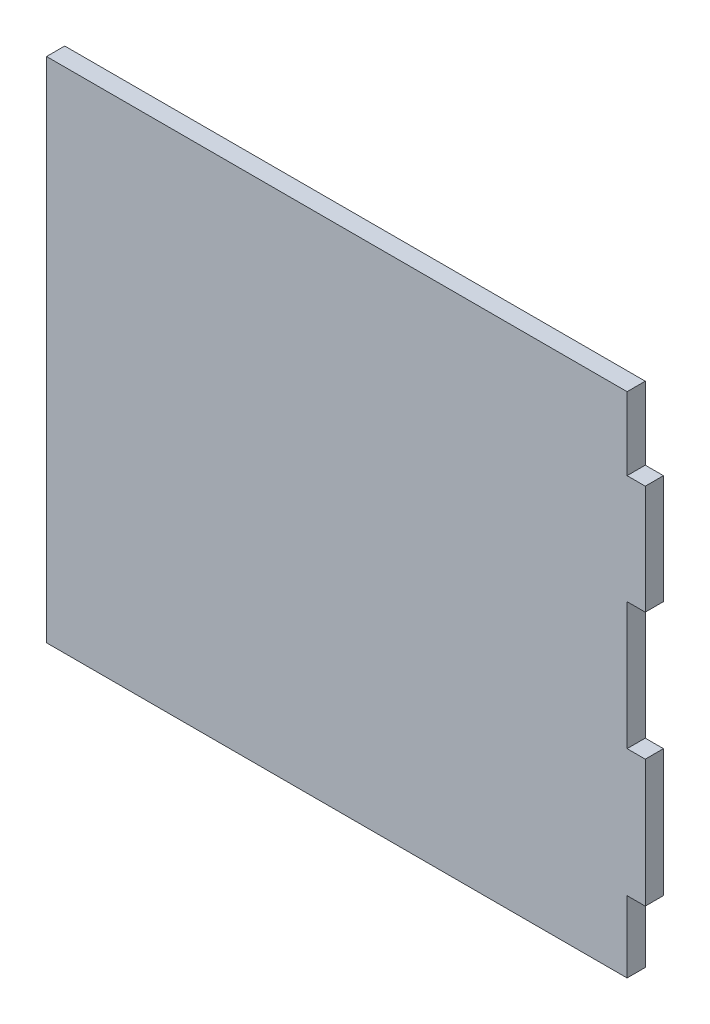
ISO-10303-21;
HEADER;
FILE_DESCRIPTION(('STEP AP214'),'2;1');
FILE_NAME('part.step','',(''),(''),'','','');
FILE_SCHEMA(('AUTOMOTIVE_DESIGN { 1 0 10303 214 1 1 1 1 }'));
ENDSEC;
DATA;
#1=APPLICATION_CONTEXT('core data for automotive mechanical design processes');
#2=APPLICATION_PROTOCOL_DEFINITION('international standard','automotive_design',2000,#1);
#3=PRODUCT_CONTEXT('',#1,'mechanical');
#4=PRODUCT('Part','Part','',(#3));
#5=PRODUCT_RELATED_PRODUCT_CATEGORY('part','',(#4));
#6=PRODUCT_DEFINITION_FORMATION('','',#4);
#7=PRODUCT_DEFINITION_CONTEXT('part definition',#1,'design');
#8=PRODUCT_DEFINITION('design','',#6,#7);
#9=PRODUCT_DEFINITION_SHAPE('','',#8);
#10=(LENGTH_UNIT() NAMED_UNIT(*) SI_UNIT(.MILLI.,.METRE.));
#11=(NAMED_UNIT(*) PLANE_ANGLE_UNIT() SI_UNIT($,.RADIAN.));
#12=(NAMED_UNIT(*) SI_UNIT($,.STERADIAN.) SOLID_ANGLE_UNIT());
#13=UNCERTAINTY_MEASURE_WITH_UNIT(LENGTH_MEASURE(1.E-05),#10,'distance_accuracy_value','');
#14=(GEOMETRIC_REPRESENTATION_CONTEXT(3) GLOBAL_UNCERTAINTY_ASSIGNED_CONTEXT((#13)) GLOBAL_UNIT_ASSIGNED_CONTEXT((#10,
#11,#12)) REPRESENTATION_CONTEXT('',''));
#15=CARTESIAN_POINT('',(0.,0.,0.));
#16=DIRECTION('',(0.,0.,1.));
#17=DIRECTION('',(1.,0.,0.));
#18=AXIS2_PLACEMENT_3D('',#15,#16,#17);
#19=CARTESIAN_POINT('',(-104.5285,-88.6533,6.35));
#20=DIRECTION('',(-1.,0.,0.));
#21=DIRECTION('',(0.,0.,1.));
#22=AXIS2_PLACEMENT_3D('',#19,#20,#21);
#23=PLANE('',#22);
#24=DIRECTION('',(0.,1.,0.));
#25=VECTOR('',#24,1.);
#26=CARTESIAN_POINT('',(-104.5285,-88.6533,0.));
#27=LINE('',#26,#25);
#28=CARTESIAN_POINT('',(-104.5285,-88.6533,0.));
#29=VERTEX_POINT('',#28);
#30=CARTESIAN_POINT('',(-104.5285,88.6534,0.));
#31=VERTEX_POINT('',#30);
#32=EDGE_CURVE('E153',#29,#31,#27,.T.);
#33=ORIENTED_EDGE('',*,*,#32,.F.);
#34=DIRECTION('',(0.,0.,-1.));
#35=VECTOR('',#34,1.);
#36=CARTESIAN_POINT('',(-104.5285,-88.6533,6.35));
#37=LINE('',#36,#35);
#38=CARTESIAN_POINT('',(-104.5285,-88.6533,6.35));
#39=VERTEX_POINT('',#38);
#40=EDGE_CURVE('E11',#39,#29,#37,.T.);
#41=ORIENTED_EDGE('',*,*,#40,.F.);
#42=DIRECTION('',(0.,1.,0.));
#43=VECTOR('',#42,1.);
#44=CARTESIAN_POINT('',(-104.5285,-88.6533,6.35));
#45=LINE('',#44,#43);
#46=CARTESIAN_POINT('',(-104.5285,88.6534,6.35));
#47=VERTEX_POINT('',#46);
#48=EDGE_CURVE('E185',#39,#47,#45,.T.);
#49=ORIENTED_EDGE('',*,*,#48,.T.);
#50=DIRECTION('',(0.,0.,-1.));
#51=VECTOR('',#50,1.);
#52=CARTESIAN_POINT('',(-104.5285,88.6534,6.35));
#53=LINE('',#52,#51);
#54=EDGE_CURVE('E35',#47,#31,#53,.T.);
#55=ORIENTED_EDGE('',*,*,#54,.T.);
#56=EDGE_LOOP('',(#33,#41,#49,#55));
#57=FACE_BOUND('',#56,.T.);
#58=ADVANCED_FACE('F32',(#57),#23,.T.);
#59=CARTESIAN_POINT('',(98.1784,-88.6533,6.35));
#60=DIRECTION('',(0.,-1.,0.));
#61=DIRECTION('',(0.,0.,-1.));
#62=AXIS2_PLACEMENT_3D('',#59,#60,#61);
#63=PLANE('',#62);
#64=DIRECTION('',(-1.,0.,0.));
#65=VECTOR('',#64,1.);
#66=CARTESIAN_POINT('',(98.1784,-88.6533,0.));
#67=LINE('',#66,#65);
#68=CARTESIAN_POINT('',(98.1784,-88.6533,0.));
#69=VERTEX_POINT('',#68);
#70=EDGE_CURVE('E183',#69,#29,#67,.T.);
#71=ORIENTED_EDGE('',*,*,#70,.F.);
#72=DIRECTION('',(0.,0.,-1.));
#73=VECTOR('',#72,1.);
#74=CARTESIAN_POINT('',(98.1784,-88.6533,6.35));
#75=LINE('',#74,#73);
#76=CARTESIAN_POINT('',(98.1784,-88.6533,6.35));
#77=VERTEX_POINT('',#76);
#78=EDGE_CURVE('E41',#77,#69,#75,.T.);
#79=ORIENTED_EDGE('',*,*,#78,.F.);
#80=DIRECTION('',(-1.,0.,0.));
#81=VECTOR('',#80,1.);
#82=CARTESIAN_POINT('',(98.1784,-88.6533,6.35));
#83=LINE('',#82,#81);
#84=EDGE_CURVE('E143',#77,#39,#83,.T.);
#85=ORIENTED_EDGE('',*,*,#84,.T.);
#86=ORIENTED_EDGE('',*,*,#40,.T.);
#87=EDGE_LOOP('',(#71,#79,#85,#86));
#88=FACE_BOUND('',#87,.T.);
#89=ADVANCED_FACE('F205',(#88),#63,.T.);
#90=CARTESIAN_POINT('',(98.1784,-63.7465,6.35));
#91=DIRECTION('',(1.,0.,0.));
#92=DIRECTION('',(0.,0.,-1.));
#93=AXIS2_PLACEMENT_3D('',#90,#91,#92);
#94=PLANE('',#93);
#95=DIRECTION('',(0.,-1.,0.));
#96=VECTOR('',#95,1.);
#97=CARTESIAN_POINT('',(98.1784,-63.7465,0.));
#98=LINE('',#97,#96);
#99=CARTESIAN_POINT('',(98.1784,-63.7465,0.));
#100=VERTEX_POINT('',#99);
#101=EDGE_CURVE('E130',#100,#69,#98,.T.);
#102=ORIENTED_EDGE('',*,*,#101,.F.);
#103=DIRECTION('',(0.,0.,-1.));
#104=VECTOR('',#103,1.);
#105=CARTESIAN_POINT('',(98.1784,-63.7465,6.35));
#106=LINE('',#105,#104);
#107=CARTESIAN_POINT('',(98.1784,-63.7465,6.35));
#108=VERTEX_POINT('',#107);
#109=EDGE_CURVE('E125',#108,#100,#106,.T.);
#110=ORIENTED_EDGE('',*,*,#109,.F.);
#111=DIRECTION('',(0.,-1.,0.));
#112=VECTOR('',#111,1.);
#113=CARTESIAN_POINT('',(98.1784,-63.7465,6.35));
#114=LINE('',#113,#112);
#115=EDGE_CURVE('E128',#108,#77,#114,.T.);
#116=ORIENTED_EDGE('',*,*,#115,.T.);
#117=ORIENTED_EDGE('',*,*,#78,.T.);
#118=EDGE_LOOP('',(#102,#110,#116,#117));
#119=FACE_BOUND('',#118,.T.);
#120=ADVANCED_FACE('F127',(#119),#94,.T.);
#121=CARTESIAN_POINT('',(104.5284,-63.7465,6.35));
#122=DIRECTION('',(0.,-1.,0.));
#123=DIRECTION('',(0.,0.,-1.));
#124=AXIS2_PLACEMENT_3D('',#121,#122,#123);
#125=PLANE('',#124);
#126=DIRECTION('',(-1.,0.,0.));
#127=VECTOR('',#126,1.);
#128=CARTESIAN_POINT('',(104.5284,-63.7465,0.));
#129=LINE('',#128,#127);
#130=CARTESIAN_POINT('',(104.5284,-63.7465,0.));
#131=VERTEX_POINT('',#130);
#132=EDGE_CURVE('E180',#131,#100,#129,.T.);
#133=ORIENTED_EDGE('',*,*,#132,.F.);
#134=DIRECTION('',(0.,0.,-1.));
#135=VECTOR('',#134,1.);
#136=CARTESIAN_POINT('',(104.5284,-63.7465,6.35));
#137=LINE('',#136,#135);
#138=CARTESIAN_POINT('',(104.5284,-63.7465,6.35));
#139=VERTEX_POINT('',#138);
#140=EDGE_CURVE('E135',#139,#131,#137,.T.);
#141=ORIENTED_EDGE('',*,*,#140,.F.);
#142=DIRECTION('',(-1.,0.,0.));
#143=VECTOR('',#142,1.);
#144=CARTESIAN_POINT('',(104.5284,-63.7465,6.35));
#145=LINE('',#144,#143);
#146=EDGE_CURVE('E141',#139,#108,#145,.T.);
#147=ORIENTED_EDGE('',*,*,#146,.T.);
#148=ORIENTED_EDGE('',*,*,#109,.T.);
#149=EDGE_LOOP('',(#133,#141,#147,#148));
#150=FACE_BOUND('',#149,.T.);
#151=ADVANCED_FACE('F145',(#150),#125,.T.);
#152=CARTESIAN_POINT('',(104.5284,-19.2966,6.35));
#153=DIRECTION('',(1.,0.,0.));
#154=DIRECTION('',(0.,0.,-1.));
#155=AXIS2_PLACEMENT_3D('',#152,#153,#154);
#156=PLANE('',#155);
#157=DIRECTION('',(0.,-1.,0.));
#158=VECTOR('',#157,1.);
#159=CARTESIAN_POINT('',(104.5284,-19.2966,0.));
#160=LINE('',#159,#158);
#161=CARTESIAN_POINT('',(104.5284,-19.2966,0.));
#162=VERTEX_POINT('',#161);
#163=EDGE_CURVE('E177',#162,#131,#160,.T.);
#164=ORIENTED_EDGE('',*,*,#163,.F.);
#165=DIRECTION('',(0.,0.,-1.));
#166=VECTOR('',#165,1.);
#167=CARTESIAN_POINT('',(104.5284,-19.2966,6.35));
#168=LINE('',#167,#166);
#169=CARTESIAN_POINT('',(104.5284,-19.2966,6.35));
#170=VERTEX_POINT('',#169);
#171=EDGE_CURVE('E189',#170,#162,#168,.T.);
#172=ORIENTED_EDGE('',*,*,#171,.F.);
#173=DIRECTION('',(0.,-1.,0.));
#174=VECTOR('',#173,1.);
#175=CARTESIAN_POINT('',(104.5284,-19.2966,6.35));
#176=LINE('',#175,#174);
#177=EDGE_CURVE('E146',#170,#139,#176,.T.);
#178=ORIENTED_EDGE('',*,*,#177,.T.);
#179=ORIENTED_EDGE('',*,*,#140,.T.);
#180=EDGE_LOOP('',(#164,#172,#178,#179));
#181=FACE_BOUND('',#180,.T.);
#182=ADVANCED_FACE('F218',(#181),#156,.T.);
#183=CARTESIAN_POINT('',(98.1784,-19.2966,6.35));
#184=DIRECTION('',(0.,1.,0.));
#185=DIRECTION('',(0.,0.,1.));
#186=AXIS2_PLACEMENT_3D('',#183,#184,#185);
#187=PLANE('',#186);
#188=DIRECTION('',(1.,0.,0.));
#189=VECTOR('',#188,1.);
#190=CARTESIAN_POINT('',(98.1784,-19.2966,0.));
#191=LINE('',#190,#189);
#192=CARTESIAN_POINT('',(98.1784,-19.2966,0.));
#193=VERTEX_POINT('',#192);
#194=EDGE_CURVE('E174',#193,#162,#191,.T.);
#195=ORIENTED_EDGE('',*,*,#194,.F.);
#196=DIRECTION('',(0.,0.,-1.));
#197=VECTOR('',#196,1.);
#198=CARTESIAN_POINT('',(98.1784,-19.2966,6.35));
#199=LINE('',#198,#197);
#200=CARTESIAN_POINT('',(98.1784,-19.2966,6.35));
#201=VERTEX_POINT('',#200);
#202=EDGE_CURVE('E191',#201,#193,#199,.T.);
#203=ORIENTED_EDGE('',*,*,#202,.F.);
#204=DIRECTION('',(1.,0.,0.));
#205=VECTOR('',#204,1.);
#206=CARTESIAN_POINT('',(98.1784,-19.2966,6.35));
#207=LINE('',#206,#205);
#208=EDGE_CURVE('E148',#201,#170,#207,.T.);
#209=ORIENTED_EDGE('',*,*,#208,.T.);
#210=ORIENTED_EDGE('',*,*,#171,.T.);
#211=EDGE_LOOP('',(#195,#203,#209,#210));
#212=FACE_BOUND('',#211,.T.);
#213=ADVANCED_FACE('F221',(#212),#187,.T.);
#214=CARTESIAN_POINT('',(98.1784,25.1534,6.35));
#215=DIRECTION('',(1.,0.,0.));
#216=DIRECTION('',(0.,0.,-1.));
#217=AXIS2_PLACEMENT_3D('',#214,#215,#216);
#218=PLANE('',#217);
#219=DIRECTION('',(0.,-1.,0.));
#220=VECTOR('',#219,1.);
#221=CARTESIAN_POINT('',(98.1784,25.1534,0.));
#222=LINE('',#221,#220);
#223=CARTESIAN_POINT('',(98.1784,25.1534,0.));
#224=VERTEX_POINT('',#223);
#225=EDGE_CURVE('E171',#224,#193,#222,.T.);
#226=ORIENTED_EDGE('',*,*,#225,.F.);
#227=DIRECTION('',(0.,0.,-1.));
#228=VECTOR('',#227,1.);
#229=CARTESIAN_POINT('',(98.1784,25.1534,6.35));
#230=LINE('',#229,#228);
#231=CARTESIAN_POINT('',(98.1784,25.1534,6.35));
#232=VERTEX_POINT('',#231);
#233=EDGE_CURVE('E193',#232,#224,#230,.T.);
#234=ORIENTED_EDGE('',*,*,#233,.F.);
#235=DIRECTION('',(0.,-1.,0.));
#236=VECTOR('',#235,1.);
#237=CARTESIAN_POINT('',(98.1784,25.1534,6.35));
#238=LINE('',#237,#236);
#239=EDGE_CURVE('E347',#232,#201,#238,.T.);
#240=ORIENTED_EDGE('',*,*,#239,.T.);
#241=ORIENTED_EDGE('',*,*,#202,.T.);
#242=EDGE_LOOP('',(#226,#234,#240,#241));
#243=FACE_BOUND('',#242,.T.);
#244=ADVANCED_FACE('F225',(#243),#218,.T.);
#245=CARTESIAN_POINT('',(104.5284,25.1534,6.35));
#246=DIRECTION('',(0.,-1.,0.));
#247=DIRECTION('',(0.,0.,-1.));
#248=AXIS2_PLACEMENT_3D('',#245,#246,#247);
#249=PLANE('',#248);
#250=DIRECTION('',(-1.,0.,0.));
#251=VECTOR('',#250,1.);
#252=CARTESIAN_POINT('',(104.5284,25.1534,0.));
#253=LINE('',#252,#251);
#254=CARTESIAN_POINT('',(104.5284,25.1534,0.));
#255=VERTEX_POINT('',#254);
#256=EDGE_CURVE('E168',#255,#224,#253,.T.);
#257=ORIENTED_EDGE('',*,*,#256,.F.);
#258=DIRECTION('',(0.,0.,-1.));
#259=VECTOR('',#258,1.);
#260=CARTESIAN_POINT('',(104.5284,25.1534,6.35));
#261=LINE('',#260,#259);
#262=CARTESIAN_POINT('',(104.5284,25.1534,6.35));
#263=VERTEX_POINT('',#262);
#264=EDGE_CURVE('E195',#263,#255,#261,.T.);
#265=ORIENTED_EDGE('',*,*,#264,.F.);
#266=DIRECTION('',(-1.,0.,0.));
#267=VECTOR('',#266,1.);
#268=CARTESIAN_POINT('',(104.5284,25.1534,6.35));
#269=LINE('',#268,#267);
#270=EDGE_CURVE('E351',#263,#232,#269,.T.);
#271=ORIENTED_EDGE('',*,*,#270,.T.);
#272=ORIENTED_EDGE('',*,*,#233,.T.);
#273=EDGE_LOOP('',(#257,#265,#271,#272));
#274=FACE_BOUND('',#273,.T.);
#275=ADVANCED_FACE('F229',(#274),#249,.T.);
#276=CARTESIAN_POINT('',(104.5284,63.2534,6.35));
#277=DIRECTION('',(1.,0.,0.));
#278=DIRECTION('',(0.,0.,-1.));
#279=AXIS2_PLACEMENT_3D('',#276,#277,#278);
#280=PLANE('',#279);
#281=DIRECTION('',(0.,-1.,0.));
#282=VECTOR('',#281,1.);
#283=CARTESIAN_POINT('',(104.5284,63.2534,0.));
#284=LINE('',#283,#282);
#285=CARTESIAN_POINT('',(104.5284,63.2534,0.));
#286=VERTEX_POINT('',#285);
#287=EDGE_CURVE('E165',#286,#255,#284,.T.);
#288=ORIENTED_EDGE('',*,*,#287,.F.);
#289=DIRECTION('',(0.,0.,-1.));
#290=VECTOR('',#289,1.);
#291=CARTESIAN_POINT('',(104.5284,63.2534,6.35));
#292=LINE('',#291,#290);
#293=CARTESIAN_POINT('',(104.5284,63.2534,6.35));
#294=VERTEX_POINT('',#293);
#295=EDGE_CURVE('E197',#294,#286,#292,.T.);
#296=ORIENTED_EDGE('',*,*,#295,.F.);
#297=DIRECTION('',(0.,-1.,0.));
#298=VECTOR('',#297,1.);
#299=CARTESIAN_POINT('',(104.5284,63.2534,6.35));
#300=LINE('',#299,#298);
#301=EDGE_CURVE('E340',#294,#263,#300,.T.);
#302=ORIENTED_EDGE('',*,*,#301,.T.);
#303=ORIENTED_EDGE('',*,*,#264,.T.);
#304=EDGE_LOOP('',(#288,#296,#302,#303));
#305=FACE_BOUND('',#304,.T.);
#306=ADVANCED_FACE('F233',(#305),#280,.T.);
#307=CARTESIAN_POINT('',(98.1784,63.2534,6.35));
#308=DIRECTION('',(0.,1.,0.));
#309=DIRECTION('',(0.,0.,1.));
#310=AXIS2_PLACEMENT_3D('',#307,#308,#309);
#311=PLANE('',#310);
#312=DIRECTION('',(1.,0.,0.));
#313=VECTOR('',#312,1.);
#314=CARTESIAN_POINT('',(98.1784,63.2534,0.));
#315=LINE('',#314,#313);
#316=CARTESIAN_POINT('',(98.1784,63.2534,0.));
#317=VERTEX_POINT('',#316);
#318=EDGE_CURVE('E162',#317,#286,#315,.T.);
#319=ORIENTED_EDGE('',*,*,#318,.F.);
#320=DIRECTION('',(0.,0.,-1.));
#321=VECTOR('',#320,1.);
#322=CARTESIAN_POINT('',(98.1784,63.2534,6.35));
#323=LINE('',#322,#321);
#324=CARTESIAN_POINT('',(98.1784,63.2534,6.35));
#325=VERTEX_POINT('',#324);
#326=EDGE_CURVE('E199',#325,#317,#323,.T.);
#327=ORIENTED_EDGE('',*,*,#326,.F.);
#328=DIRECTION('',(1.,0.,0.));
#329=VECTOR('',#328,1.);
#330=CARTESIAN_POINT('',(98.1784,63.2534,6.35));
#331=LINE('',#330,#329);
#332=EDGE_CURVE('E336',#325,#294,#331,.T.);
#333=ORIENTED_EDGE('',*,*,#332,.T.);
#334=ORIENTED_EDGE('',*,*,#295,.T.);
#335=EDGE_LOOP('',(#319,#327,#333,#334));
#336=FACE_BOUND('',#335,.T.);
#337=ADVANCED_FACE('F237',(#336),#311,.T.);
#338=CARTESIAN_POINT('',(98.1784,88.6534,6.35));
#339=DIRECTION('',(1.,0.,0.));
#340=DIRECTION('',(0.,0.,-1.));
#341=AXIS2_PLACEMENT_3D('',#338,#339,#340);
#342=PLANE('',#341);
#343=DIRECTION('',(0.,-1.,0.));
#344=VECTOR('',#343,1.);
#345=CARTESIAN_POINT('',(98.1784,88.6534,0.));
#346=LINE('',#345,#344);
#347=CARTESIAN_POINT('',(98.1784,88.6534,0.));
#348=VERTEX_POINT('',#347);
#349=EDGE_CURVE('E159',#348,#317,#346,.T.);
#350=ORIENTED_EDGE('',*,*,#349,.F.);
#351=DIRECTION('',(0.,0.,-1.));
#352=VECTOR('',#351,1.);
#353=CARTESIAN_POINT('',(98.1784,88.6534,6.35));
#354=LINE('',#353,#352);
#355=CARTESIAN_POINT('',(98.1784,88.6534,6.35));
#356=VERTEX_POINT('',#355);
#357=EDGE_CURVE('E200',#356,#348,#354,.T.);
#358=ORIENTED_EDGE('',*,*,#357,.F.);
#359=DIRECTION('',(0.,-1.,0.));
#360=VECTOR('',#359,1.);
#361=CARTESIAN_POINT('',(98.1784,88.6534,6.35));
#362=LINE('',#361,#360);
#363=EDGE_CURVE('E357',#356,#325,#362,.T.);
#364=ORIENTED_EDGE('',*,*,#363,.T.);
#365=ORIENTED_EDGE('',*,*,#326,.T.);
#366=EDGE_LOOP('',(#350,#358,#364,#365));
#367=FACE_BOUND('',#366,.T.);
#368=ADVANCED_FACE('F241',(#367),#342,.T.);
#369=CARTESIAN_POINT('',(-104.5285,88.6534,6.35));
#370=DIRECTION('',(0.,1.,0.));
#371=DIRECTION('',(0.,0.,1.));
#372=AXIS2_PLACEMENT_3D('',#369,#370,#371);
#373=PLANE('',#372);
#374=DIRECTION('',(1.,0.,0.));
#375=VECTOR('',#374,1.);
#376=CARTESIAN_POINT('',(-104.5285,88.6534,0.));
#377=LINE('',#376,#375);
#378=EDGE_CURVE('E156',#31,#348,#377,.T.);
#379=ORIENTED_EDGE('',*,*,#378,.F.);
#380=ORIENTED_EDGE('',*,*,#54,.F.);
#381=DIRECTION('',(1.,0.,0.));
#382=VECTOR('',#381,1.);
#383=CARTESIAN_POINT('',(-104.5285,88.6534,6.35));
#384=LINE('',#383,#382);
#385=EDGE_CURVE('E359',#47,#356,#384,.T.);
#386=ORIENTED_EDGE('',*,*,#385,.T.);
#387=ORIENTED_EDGE('',*,*,#357,.T.);
#388=EDGE_LOOP('',(#379,#380,#386,#387));
#389=FACE_BOUND('',#388,.T.);
#390=ADVANCED_FACE('F202',(#389),#373,.T.);
#391=CARTESIAN_POINT('',(0.,0.,6.35));
#392=DIRECTION('',(0.,0.,-1.));
#393=DIRECTION('',(-1.,0.,0.));
#394=AXIS2_PLACEMENT_3D('',#391,#392,#393);
#395=PLANE('',#394);
#396=ORIENTED_EDGE('',*,*,#48,.F.);
#397=ORIENTED_EDGE('',*,*,#84,.F.);
#398=ORIENTED_EDGE('',*,*,#115,.F.);
#399=ORIENTED_EDGE('',*,*,#146,.F.);
#400=ORIENTED_EDGE('',*,*,#177,.F.);
#401=ORIENTED_EDGE('',*,*,#208,.F.);
#402=ORIENTED_EDGE('',*,*,#239,.F.);
#403=ORIENTED_EDGE('',*,*,#270,.F.);
#404=ORIENTED_EDGE('',*,*,#301,.F.);
#405=ORIENTED_EDGE('',*,*,#332,.F.);
#406=ORIENTED_EDGE('',*,*,#363,.F.);
#407=ORIENTED_EDGE('',*,*,#385,.F.);
#408=EDGE_LOOP('',(#396,#397,#398,#399,#400,#401,#402,#403,#404,#405,#406,#407));
#409=FACE_BOUND('',#408,.T.);
#410=ADVANCED_FACE('F139',(#409),#395,.F.);
#411=CARTESIAN_POINT('',(0.,0.,0.));
#412=DIRECTION('',(0.,0.,-1.));
#413=DIRECTION('',(-1.,0.,0.));
#414=AXIS2_PLACEMENT_3D('',#411,#412,#413);
#415=PLANE('',#414);
#416=ORIENTED_EDGE('',*,*,#32,.T.);
#417=ORIENTED_EDGE('',*,*,#378,.T.);
#418=ORIENTED_EDGE('',*,*,#349,.T.);
#419=ORIENTED_EDGE('',*,*,#318,.T.);
#420=ORIENTED_EDGE('',*,*,#287,.T.);
#421=ORIENTED_EDGE('',*,*,#256,.T.);
#422=ORIENTED_EDGE('',*,*,#225,.T.);
#423=ORIENTED_EDGE('',*,*,#194,.T.);
#424=ORIENTED_EDGE('',*,*,#163,.T.);
#425=ORIENTED_EDGE('',*,*,#132,.T.);
#426=ORIENTED_EDGE('',*,*,#101,.T.);
#427=ORIENTED_EDGE('',*,*,#70,.T.);
#428=EDGE_LOOP('',(#416,#417,#418,#419,#420,#421,#422,#423,#424,#425,#426,#427));
#429=FACE_BOUND('',#428,.T.);
#430=ADVANCED_FACE('F204',(#429),#415,.T.);
#431=CLOSED_SHELL('',(#58,#89,#120,#151,#182,#213,#244,#275,#306,#337,#368,#390,#410,#430));
#432=MANIFOLD_SOLID_BREP('B2',#431);
#433=ADVANCED_BREP_SHAPE_REPRESENTATION('',(#18,#432),#14);
#434=SHAPE_DEFINITION_REPRESENTATION(#9,#433);
ENDSEC;
END-ISO-10303-21;
